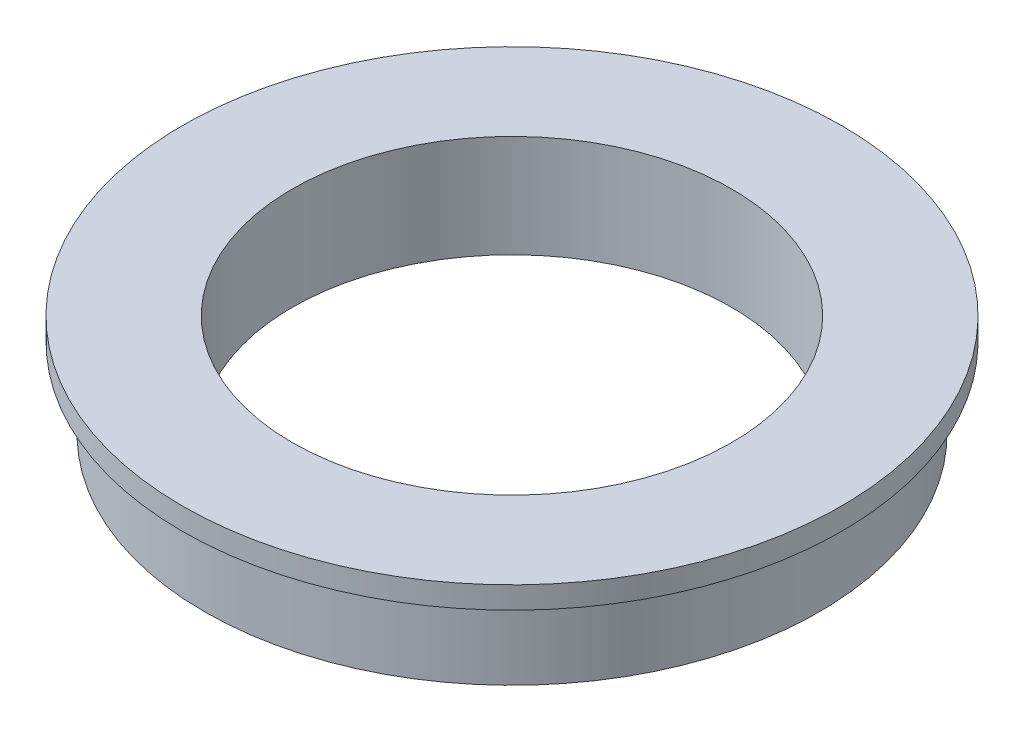
ISO-10303-21;
HEADER;
FILE_DESCRIPTION(('STEP AP214'),'2;1');
FILE_NAME('part.step','',(''),(''),'','','');
FILE_SCHEMA(('AUTOMOTIVE_DESIGN { 1 0 10303 214 1 1 1 1 }'));
ENDSEC;
DATA;
#1=APPLICATION_CONTEXT('core data for automotive mechanical design processes');
#2=APPLICATION_PROTOCOL_DEFINITION('international standard','automotive_design',2000,#1);
#3=PRODUCT_CONTEXT('',#1,'mechanical');
#4=PRODUCT('Part','Part','',(#3));
#5=PRODUCT_RELATED_PRODUCT_CATEGORY('part','',(#4));
#6=PRODUCT_DEFINITION_FORMATION('','',#4);
#7=PRODUCT_DEFINITION_CONTEXT('part definition',#1,'design');
#8=PRODUCT_DEFINITION('design','',#6,#7);
#9=PRODUCT_DEFINITION_SHAPE('','',#8);
#10=(LENGTH_UNIT() NAMED_UNIT(*) SI_UNIT(.MILLI.,.METRE.));
#11=(NAMED_UNIT(*) PLANE_ANGLE_UNIT() SI_UNIT($,.RADIAN.));
#12=(NAMED_UNIT(*) SI_UNIT($,.STERADIAN.) SOLID_ANGLE_UNIT());
#13=UNCERTAINTY_MEASURE_WITH_UNIT(LENGTH_MEASURE(1.E-05),#10,'distance_accuracy_value','');
#14=(GEOMETRIC_REPRESENTATION_CONTEXT(3) GLOBAL_UNCERTAINTY_ASSIGNED_CONTEXT((#13)) GLOBAL_UNIT_ASSIGNED_CONTEXT((#10,
#11,#12)) REPRESENTATION_CONTEXT('',''));
#15=CARTESIAN_POINT('',(0.,0.,0.));
#16=DIRECTION('',(0.,0.,1.));
#17=DIRECTION('',(1.,0.,0.));
#18=AXIS2_PLACEMENT_3D('',#15,#16,#17);
#19=CARTESIAN_POINT('',(0.,0.,0.));
#20=DIRECTION('',(0.,1.,0.));
#21=DIRECTION('',(0.,0.,1.));
#22=AXIS2_PLACEMENT_3D('',#19,#20,#21);
#23=PLANE('',#22);
#24=CARTESIAN_POINT('',(0.,0.,0.));
#25=DIRECTION('',(0.,1.,0.));
#26=DIRECTION('',(0.,0.,1.));
#27=AXIS2_PLACEMENT_3D('',#24,#25,#26);
#28=CIRCLE('',#27,21.);
#29=CARTESIAN_POINT('',(0.,0.,21.));
#30=VERTEX_POINT('',#29);
#31=EDGE_CURVE('E43',#30,#30,#28,.T.);
#32=ORIENTED_EDGE('',*,*,#31,.F.);
#33=EDGE_LOOP('',(#32));
#34=FACE_BOUND('',#33,.T.);
#35=CARTESIAN_POINT('',(0.,0.,0.));
#36=DIRECTION('',(0.,1.,0.));
#37=DIRECTION('',(0.,0.,1.));
#38=AXIS2_PLACEMENT_3D('',#35,#36,#37);
#39=CIRCLE('',#38,15.);
#40=CARTESIAN_POINT('',(0.,0.,15.));
#41=VERTEX_POINT('',#40);
#42=EDGE_CURVE('E50',#41,#41,#39,.T.);
#43=ORIENTED_EDGE('',*,*,#42,.T.);
#44=EDGE_LOOP('',(#43));
#45=FACE_BOUND('',#44,.T.);
#46=ADVANCED_FACE('F39',(#34,#45),#23,.F.);
#47=CARTESIAN_POINT('',(0.,5.5,0.));
#48=DIRECTION('',(0.,-1.,0.));
#49=DIRECTION('',(0.,0.,-1.));
#50=AXIS2_PLACEMENT_3D('',#47,#48,#49);
#51=CYLINDRICAL_SURFACE('',#50,21.);
#52=CARTESIAN_POINT('',(0.,5.5,0.));
#53=DIRECTION('',(0.,1.,0.));
#54=DIRECTION('',(0.,0.,1.));
#55=AXIS2_PLACEMENT_3D('',#52,#53,#54);
#56=CIRCLE('',#55,21.);
#57=CARTESIAN_POINT('',(0.,5.5,21.));
#58=VERTEX_POINT('',#57);
#59=EDGE_CURVE('E10',#58,#58,#56,.T.);
#60=ORIENTED_EDGE('',*,*,#59,.F.);
#61=EDGE_LOOP('',(#60));
#62=FACE_BOUND('',#61,.T.);
#63=ORIENTED_EDGE('',*,*,#31,.T.);
#64=EDGE_LOOP('',(#63));
#65=FACE_BOUND('',#64,.T.);
#66=ADVANCED_FACE('F41',(#62,#65),#51,.T.);
#67=CARTESIAN_POINT('',(0.,5.5,0.));
#68=DIRECTION('',(0.,-1.,0.));
#69=DIRECTION('',(0.,0.,-1.));
#70=AXIS2_PLACEMENT_3D('',#67,#68,#69);
#71=CYLINDRICAL_SURFACE('',#70,15.);
#72=ORIENTED_EDGE('',*,*,#42,.F.);
#73=EDGE_LOOP('',(#72));
#74=FACE_BOUND('',#73,.T.);
#75=CARTESIAN_POINT('',(0.,7.,0.));
#76=DIRECTION('',(0.,1.,0.));
#77=DIRECTION('',(0.,0.,1.));
#78=AXIS2_PLACEMENT_3D('',#75,#76,#77);
#79=CIRCLE('',#78,15.);
#80=CARTESIAN_POINT('',(0.,7.,15.));
#81=VERTEX_POINT('',#80);
#82=EDGE_CURVE('E58',#81,#81,#79,.T.);
#83=ORIENTED_EDGE('',*,*,#82,.T.);
#84=EDGE_LOOP('',(#83));
#85=FACE_BOUND('',#84,.T.);
#86=ADVANCED_FACE('F64',(#74,#85),#71,.F.);
#87=CARTESIAN_POINT('',(0.,7.,0.));
#88=DIRECTION('',(0.,1.,0.));
#89=DIRECTION('',(0.,0.,1.));
#90=AXIS2_PLACEMENT_3D('',#87,#88,#89);
#91=PLANE('',#90);
#92=CARTESIAN_POINT('',(0.,7.,0.));
#93=DIRECTION('',(0.,1.,0.));
#94=DIRECTION('',(0.,0.,1.));
#95=AXIS2_PLACEMENT_3D('',#92,#93,#94);
#96=CIRCLE('',#95,22.5);
#97=CARTESIAN_POINT('',(0.,7.,22.5));
#98=VERTEX_POINT('',#97);
#99=EDGE_CURVE('E54',#98,#98,#96,.T.);
#100=ORIENTED_EDGE('',*,*,#99,.T.);
#101=EDGE_LOOP('',(#100));
#102=FACE_BOUND('',#101,.T.);
#103=ORIENTED_EDGE('',*,*,#82,.F.);
#104=EDGE_LOOP('',(#103));
#105=FACE_BOUND('',#104,.T.);
#106=ADVANCED_FACE('F66',(#102,#105),#91,.T.);
#107=CARTESIAN_POINT('',(0.,5.5,0.));
#108=DIRECTION('',(0.,1.,0.));
#109=DIRECTION('',(0.,0.,1.));
#110=AXIS2_PLACEMENT_3D('',#107,#108,#109);
#111=PLANE('',#110);
#112=ORIENTED_EDGE('',*,*,#59,.T.);
#113=EDGE_LOOP('',(#112));
#114=FACE_BOUND('',#113,.T.);
#115=CARTESIAN_POINT('',(0.,5.5,0.));
#116=DIRECTION('',(0.,1.,0.));
#117=DIRECTION('',(0.,0.,1.));
#118=AXIS2_PLACEMENT_3D('',#115,#116,#117);
#119=CIRCLE('',#118,22.5);
#120=CARTESIAN_POINT('',(0.,5.5,22.5));
#121=VERTEX_POINT('',#120);
#122=EDGE_CURVE('E55',#121,#121,#119,.T.);
#123=ORIENTED_EDGE('',*,*,#122,.F.);
#124=EDGE_LOOP('',(#123));
#125=FACE_BOUND('',#124,.T.);
#126=ADVANCED_FACE('F68',(#114,#125),#111,.F.);
#127=CARTESIAN_POINT('',(0.,7.,0.));
#128=DIRECTION('',(0.,-1.,0.));
#129=DIRECTION('',(0.,0.,-1.));
#130=AXIS2_PLACEMENT_3D('',#127,#128,#129);
#131=CYLINDRICAL_SURFACE('',#130,22.5);
#132=ORIENTED_EDGE('',*,*,#99,.F.);
#133=EDGE_LOOP('',(#132));
#134=FACE_BOUND('',#133,.T.);
#135=ORIENTED_EDGE('',*,*,#122,.T.);
#136=EDGE_LOOP('',(#135));
#137=FACE_BOUND('',#136,.T.);
#138=ADVANCED_FACE('F75',(#134,#137),#131,.T.);
#139=CLOSED_SHELL('',(#46,#66,#86,#106,#126,#138));
#140=MANIFOLD_SOLID_BREP('B2',#139);
#141=ADVANCED_BREP_SHAPE_REPRESENTATION('',(#18,#140),#14);
#142=SHAPE_DEFINITION_REPRESENTATION(#9,#141);
ENDSEC;
END-ISO-10303-21;
